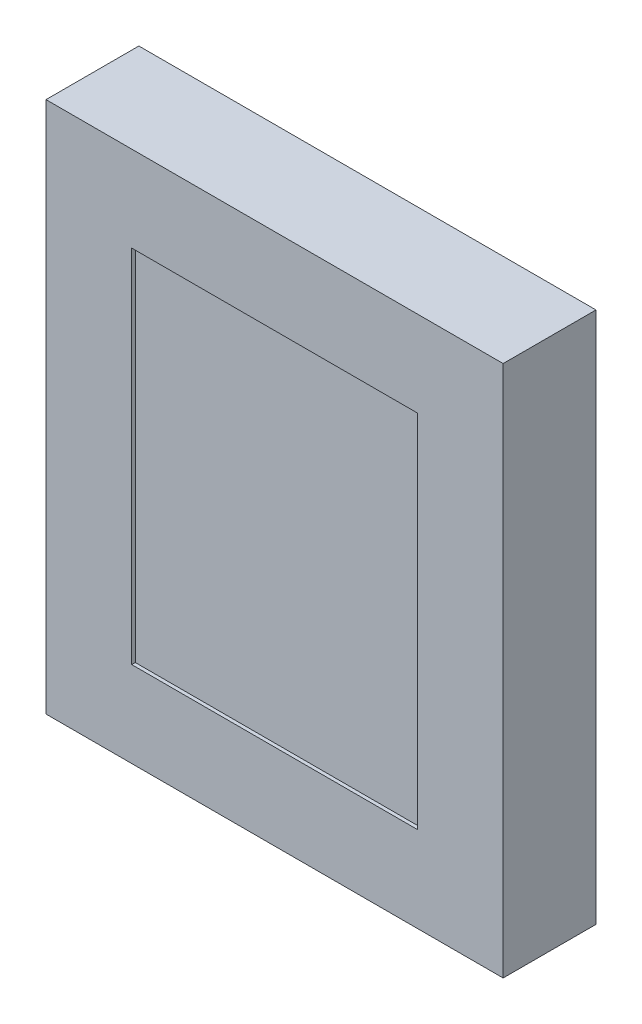
ISO-10303-21;
HEADER;
FILE_DESCRIPTION(('STEP AP214'),'2;1');
FILE_NAME('part.step','',(''),(''),'','','');
FILE_SCHEMA(('AUTOMOTIVE_DESIGN { 1 0 10303 214 1 1 1 1 }'));
ENDSEC;
DATA;
#1=APPLICATION_CONTEXT('core data for automotive mechanical design processes');
#2=APPLICATION_PROTOCOL_DEFINITION('international standard','automotive_design',2000,#1);
#3=PRODUCT_CONTEXT('',#1,'mechanical');
#4=PRODUCT('Part','Part','',(#3));
#5=PRODUCT_RELATED_PRODUCT_CATEGORY('part','',(#4));
#6=PRODUCT_DEFINITION_FORMATION('','',#4);
#7=PRODUCT_DEFINITION_CONTEXT('part definition',#1,'design');
#8=PRODUCT_DEFINITION('design','',#6,#7);
#9=PRODUCT_DEFINITION_SHAPE('','',#8);
#10=(LENGTH_UNIT() NAMED_UNIT(*) SI_UNIT(.MILLI.,.METRE.));
#11=(NAMED_UNIT(*) PLANE_ANGLE_UNIT() SI_UNIT($,.RADIAN.));
#12=(NAMED_UNIT(*) SI_UNIT($,.STERADIAN.) SOLID_ANGLE_UNIT());
#13=UNCERTAINTY_MEASURE_WITH_UNIT(LENGTH_MEASURE(1.E-05),#10,'distance_accuracy_value','');
#14=(GEOMETRIC_REPRESENTATION_CONTEXT(3) GLOBAL_UNCERTAINTY_ASSIGNED_CONTEXT((#13)) GLOBAL_UNIT_ASSIGNED_CONTEXT((#10,
#11,#12)) REPRESENTATION_CONTEXT('',''));
#15=CARTESIAN_POINT('',(0.,0.,0.));
#16=DIRECTION('',(0.,0.,1.));
#17=DIRECTION('',(1.,0.,0.));
#18=AXIS2_PLACEMENT_3D('',#15,#16,#17);
#19=CARTESIAN_POINT('',(320.,372.5,-65.));
#20=DIRECTION('',(0.,1.,0.));
#21=DIRECTION('',(0.,0.,1.));
#22=AXIS2_PLACEMENT_3D('',#19,#20,#21);
#23=PLANE('',#22);
#24=DIRECTION('',(0.,0.,1.));
#25=VECTOR('',#24,1.);
#26=CARTESIAN_POINT('',(-320.,372.5,-65.));
#27=LINE('',#26,#25);
#28=CARTESIAN_POINT('',(-320.,372.5,-65.));
#29=VERTEX_POINT('',#28);
#30=CARTESIAN_POINT('',(-320.,372.5,65.));
#31=VERTEX_POINT('',#30);
#32=EDGE_CURVE('E62',#29,#31,#27,.T.);
#33=ORIENTED_EDGE('',*,*,#32,.T.);
#34=DIRECTION('',(-1.,0.,0.));
#35=VECTOR('',#34,1.);
#36=CARTESIAN_POINT('',(320.,372.5,65.));
#37=LINE('',#36,#35);
#38=CARTESIAN_POINT('',(320.,372.5,65.));
#39=VERTEX_POINT('',#38);
#40=EDGE_CURVE('E160',#39,#31,#37,.T.);
#41=ORIENTED_EDGE('',*,*,#40,.F.);
#42=DIRECTION('',(0.,0.,1.));
#43=VECTOR('',#42,1.);
#44=CARTESIAN_POINT('',(320.,372.5,-65.));
#45=LINE('',#44,#43);
#46=CARTESIAN_POINT('',(320.,372.5,-65.));
#47=VERTEX_POINT('',#46);
#48=EDGE_CURVE('E12',#47,#39,#45,.T.);
#49=ORIENTED_EDGE('',*,*,#48,.F.);
#50=DIRECTION('',(-1.,0.,0.));
#51=VECTOR('',#50,1.);
#52=CARTESIAN_POINT('',(320.,372.5,-65.));
#53=LINE('',#52,#51);
#54=EDGE_CURVE('E188',#47,#29,#53,.T.);
#55=ORIENTED_EDGE('',*,*,#54,.T.);
#56=EDGE_LOOP('',(#33,#41,#49,#55));
#57=FACE_BOUND('',#56,.T.);
#58=ADVANCED_FACE('F59',(#57),#23,.T.);
#59=CARTESIAN_POINT('',(320.,-372.5,-65.));
#60=DIRECTION('',(1.,0.,0.));
#61=DIRECTION('',(0.,1.,0.));
#62=AXIS2_PLACEMENT_3D('',#59,#60,#61);
#63=PLANE('',#62);
#64=ORIENTED_EDGE('',*,*,#48,.T.);
#65=DIRECTION('',(0.,1.,0.));
#66=VECTOR('',#65,1.);
#67=CARTESIAN_POINT('',(320.,-372.5,65.));
#68=LINE('',#67,#66);
#69=CARTESIAN_POINT('',(320.,-372.5,65.));
#70=VERTEX_POINT('',#69);
#71=EDGE_CURVE('E172',#70,#39,#68,.T.);
#72=ORIENTED_EDGE('',*,*,#71,.F.);
#73=DIRECTION('',(0.,0.,1.));
#74=VECTOR('',#73,1.);
#75=CARTESIAN_POINT('',(320.,-372.5,-65.));
#76=LINE('',#75,#74);
#77=CARTESIAN_POINT('',(320.,-372.5,-65.));
#78=VERTEX_POINT('',#77);
#79=EDGE_CURVE('E68',#78,#70,#76,.T.);
#80=ORIENTED_EDGE('',*,*,#79,.F.);
#81=DIRECTION('',(0.,1.,0.));
#82=VECTOR('',#81,1.);
#83=CARTESIAN_POINT('',(320.,-372.5,-65.));
#84=LINE('',#83,#82);
#85=EDGE_CURVE('E204',#78,#47,#84,.T.);
#86=ORIENTED_EDGE('',*,*,#85,.T.);
#87=EDGE_LOOP('',(#64,#72,#80,#86));
#88=FACE_BOUND('',#87,.T.);
#89=ADVANCED_FACE('F220',(#88),#63,.T.);
#90=CARTESIAN_POINT('',(-320.,-372.5,-65.));
#91=DIRECTION('',(0.,-1.,0.));
#92=DIRECTION('',(0.,0.,-1.));
#93=AXIS2_PLACEMENT_3D('',#90,#91,#92);
#94=PLANE('',#93);
#95=ORIENTED_EDGE('',*,*,#79,.T.);
#96=DIRECTION('',(1.,0.,0.));
#97=VECTOR('',#96,1.);
#98=CARTESIAN_POINT('',(-320.,-372.5,65.));
#99=LINE('',#98,#97);
#100=CARTESIAN_POINT('',(-320.,-372.5,65.));
#101=VERTEX_POINT('',#100);
#102=EDGE_CURVE('E168',#101,#70,#99,.T.);
#103=ORIENTED_EDGE('',*,*,#102,.F.);
#104=DIRECTION('',(0.,0.,1.));
#105=VECTOR('',#104,1.);
#106=CARTESIAN_POINT('',(-320.,-372.5,-65.));
#107=LINE('',#106,#105);
#108=CARTESIAN_POINT('',(-320.,-372.5,-65.));
#109=VERTEX_POINT('',#108);
#110=EDGE_CURVE('E209',#109,#101,#107,.T.);
#111=ORIENTED_EDGE('',*,*,#110,.F.);
#112=DIRECTION('',(1.,0.,0.));
#113=VECTOR('',#112,1.);
#114=CARTESIAN_POINT('',(-320.,-372.5,-65.));
#115=LINE('',#114,#113);
#116=EDGE_CURVE('E200',#109,#78,#115,.T.);
#117=ORIENTED_EDGE('',*,*,#116,.T.);
#118=EDGE_LOOP('',(#95,#103,#111,#117));
#119=FACE_BOUND('',#118,.T.);
#120=ADVANCED_FACE('F226',(#119),#94,.T.);
#121=CARTESIAN_POINT('',(-320.,372.5,-65.));
#122=DIRECTION('',(-1.,0.,0.));
#123=DIRECTION('',(0.,-1.,0.));
#124=AXIS2_PLACEMENT_3D('',#121,#122,#123);
#125=PLANE('',#124);
#126=ORIENTED_EDGE('',*,*,#110,.T.);
#127=DIRECTION('',(0.,-1.,0.));
#128=VECTOR('',#127,1.);
#129=CARTESIAN_POINT('',(-320.,372.5,65.));
#130=LINE('',#129,#128);
#131=EDGE_CURVE('E164',#31,#101,#130,.T.);
#132=ORIENTED_EDGE('',*,*,#131,.F.);
#133=ORIENTED_EDGE('',*,*,#32,.F.);
#134=DIRECTION('',(0.,-1.,0.));
#135=VECTOR('',#134,1.);
#136=CARTESIAN_POINT('',(-320.,372.5,-65.));
#137=LINE('',#136,#135);
#138=EDGE_CURVE('E196',#29,#109,#137,.T.);
#139=ORIENTED_EDGE('',*,*,#138,.T.);
#140=EDGE_LOOP('',(#126,#132,#133,#139));
#141=FACE_BOUND('',#140,.T.);
#142=ADVANCED_FACE('F215',(#141),#125,.T.);
#143=CARTESIAN_POINT('',(0.,0.,-65.));
#144=DIRECTION('',(0.,0.,1.));
#145=DIRECTION('',(1.,0.,0.));
#146=AXIS2_PLACEMENT_3D('',#143,#144,#145);
#147=PLANE('',#146);
#148=DIRECTION('',(0.,1.,0.));
#149=VECTOR('',#148,1.);
#150=CARTESIAN_POINT('',(200.,-252.5,-65.));
#151=LINE('',#150,#149);
#152=CARTESIAN_POINT('',(200.,-252.5,-65.));
#153=VERTEX_POINT('',#152);
#154=CARTESIAN_POINT('',(200.,252.5,-65.));
#155=VERTEX_POINT('',#154);
#156=EDGE_CURVE('E138',#153,#155,#151,.T.);
#157=ORIENTED_EDGE('',*,*,#156,.T.);
#158=DIRECTION('',(-1.,0.,0.));
#159=VECTOR('',#158,1.);
#160=CARTESIAN_POINT('',(200.,252.5,-65.));
#161=LINE('',#160,#159);
#162=CARTESIAN_POINT('',(-200.,252.5,-65.));
#163=VERTEX_POINT('',#162);
#164=EDGE_CURVE('E176',#155,#163,#161,.T.);
#165=ORIENTED_EDGE('',*,*,#164,.T.);
#166=DIRECTION('',(0.,-1.,0.));
#167=VECTOR('',#166,1.);
#168=CARTESIAN_POINT('',(-200.,252.5,-65.));
#169=LINE('',#168,#167);
#170=CARTESIAN_POINT('',(-200.,-252.5,-65.));
#171=VERTEX_POINT('',#170);
#172=EDGE_CURVE('E132',#163,#171,#169,.T.);
#173=ORIENTED_EDGE('',*,*,#172,.T.);
#174=DIRECTION('',(1.,0.,0.));
#175=VECTOR('',#174,1.);
#176=CARTESIAN_POINT('',(-200.,-252.5,-65.));
#177=LINE('',#176,#175);
#178=EDGE_CURVE('E76',#171,#153,#177,.T.);
#179=ORIENTED_EDGE('',*,*,#178,.T.);
#180=EDGE_LOOP('',(#157,#165,#173,#179));
#181=FACE_BOUND('',#180,.T.);
#182=ORIENTED_EDGE('',*,*,#54,.F.);
#183=ORIENTED_EDGE('',*,*,#85,.F.);
#184=ORIENTED_EDGE('',*,*,#116,.F.);
#185=ORIENTED_EDGE('',*,*,#138,.F.);
#186=EDGE_LOOP('',(#182,#183,#184,#185));
#187=FACE_BOUND('',#186,.T.);
#188=ADVANCED_FACE('F224',(#181,#187),#147,.F.);
#189=CARTESIAN_POINT('',(200.,252.5,-65.));
#190=DIRECTION('',(0.,1.,0.));
#191=DIRECTION('',(0.,0.,1.));
#192=AXIS2_PLACEMENT_3D('',#189,#190,#191);
#193=PLANE('',#192);
#194=DIRECTION('',(0.,0.,1.));
#195=VECTOR('',#194,1.);
#196=CARTESIAN_POINT('',(200.,252.5,-65.));
#197=LINE('',#196,#195);
#198=CARTESIAN_POINT('',(200.,252.5,65.));
#199=VERTEX_POINT('',#198);
#200=EDGE_CURVE('E143',#155,#199,#197,.T.);
#201=ORIENTED_EDGE('',*,*,#200,.T.);
#202=DIRECTION('',(-1.,0.,0.));
#203=VECTOR('',#202,1.);
#204=CARTESIAN_POINT('',(200.,252.5,65.));
#205=LINE('',#204,#203);
#206=CARTESIAN_POINT('',(-200.,252.5,65.));
#207=VERTEX_POINT('',#206);
#208=EDGE_CURVE('E141',#199,#207,#205,.T.);
#209=ORIENTED_EDGE('',*,*,#208,.T.);
#210=DIRECTION('',(0.,0.,1.));
#211=VECTOR('',#210,1.);
#212=CARTESIAN_POINT('',(-200.,252.5,-65.));
#213=LINE('',#212,#211);
#214=EDGE_CURVE('E125',#163,#207,#213,.T.);
#215=ORIENTED_EDGE('',*,*,#214,.F.);
#216=ORIENTED_EDGE('',*,*,#164,.F.);
#217=EDGE_LOOP('',(#201,#209,#215,#216));
#218=FACE_BOUND('',#217,.T.);
#219=ADVANCED_FACE('F142',(#218),#193,.F.);
#220=CARTESIAN_POINT('',(200.,-252.5,-65.));
#221=DIRECTION('',(1.,0.,0.));
#222=DIRECTION('',(0.,1.,0.));
#223=AXIS2_PLACEMENT_3D('',#220,#221,#222);
#224=PLANE('',#223);
#225=DIRECTION('',(0.,0.,1.));
#226=VECTOR('',#225,1.);
#227=CARTESIAN_POINT('',(200.,-252.5,-65.));
#228=LINE('',#227,#226);
#229=CARTESIAN_POINT('',(200.,-252.5,65.));
#230=VERTEX_POINT('',#229);
#231=EDGE_CURVE('E189',#153,#230,#228,.T.);
#232=ORIENTED_EDGE('',*,*,#231,.T.);
#233=DIRECTION('',(0.,1.,0.));
#234=VECTOR('',#233,1.);
#235=CARTESIAN_POINT('',(200.,-252.5,65.));
#236=LINE('',#235,#234);
#237=EDGE_CURVE('E155',#230,#199,#236,.T.);
#238=ORIENTED_EDGE('',*,*,#237,.T.);
#239=ORIENTED_EDGE('',*,*,#200,.F.);
#240=ORIENTED_EDGE('',*,*,#156,.F.);
#241=EDGE_LOOP('',(#232,#238,#239,#240));
#242=FACE_BOUND('',#241,.T.);
#243=ADVANCED_FACE('F269',(#242),#224,.F.);
#244=CARTESIAN_POINT('',(-200.,-252.5,-65.));
#245=DIRECTION('',(0.,-1.,0.));
#246=DIRECTION('',(0.,0.,-1.));
#247=AXIS2_PLACEMENT_3D('',#244,#245,#246);
#248=PLANE('',#247);
#249=DIRECTION('',(0.,0.,1.));
#250=VECTOR('',#249,1.);
#251=CARTESIAN_POINT('',(-200.,-252.5,-65.));
#252=LINE('',#251,#250);
#253=CARTESIAN_POINT('',(-200.,-252.5,65.));
#254=VERTEX_POINT('',#253);
#255=EDGE_CURVE('E137',#171,#254,#252,.T.);
#256=ORIENTED_EDGE('',*,*,#255,.T.);
#257=DIRECTION('',(1.,0.,0.));
#258=VECTOR('',#257,1.);
#259=CARTESIAN_POINT('',(-200.,-252.5,65.));
#260=LINE('',#259,#258);
#261=EDGE_CURVE('E151',#254,#230,#260,.T.);
#262=ORIENTED_EDGE('',*,*,#261,.T.);
#263=ORIENTED_EDGE('',*,*,#231,.F.);
#264=ORIENTED_EDGE('',*,*,#178,.F.);
#265=EDGE_LOOP('',(#256,#262,#263,#264));
#266=FACE_BOUND('',#265,.T.);
#267=ADVANCED_FACE('F278',(#266),#248,.F.);
#268=CARTESIAN_POINT('',(-200.,252.5,-65.));
#269=DIRECTION('',(-1.,0.,0.));
#270=DIRECTION('',(0.,-1.,0.));
#271=AXIS2_PLACEMENT_3D('',#268,#269,#270);
#272=PLANE('',#271);
#273=ORIENTED_EDGE('',*,*,#214,.T.);
#274=DIRECTION('',(0.,-1.,0.));
#275=VECTOR('',#274,1.);
#276=CARTESIAN_POINT('',(-200.,252.5,65.));
#277=LINE('',#276,#275);
#278=EDGE_CURVE('E129',#207,#254,#277,.T.);
#279=ORIENTED_EDGE('',*,*,#278,.T.);
#280=ORIENTED_EDGE('',*,*,#255,.F.);
#281=ORIENTED_EDGE('',*,*,#172,.F.);
#282=EDGE_LOOP('',(#273,#279,#280,#281));
#283=FACE_BOUND('',#282,.T.);
#284=ADVANCED_FACE('F127',(#283),#272,.F.);
#285=CARTESIAN_POINT('',(0.,0.,65.));
#286=DIRECTION('',(0.,0.,1.));
#287=DIRECTION('',(1.,0.,0.));
#288=AXIS2_PLACEMENT_3D('',#285,#286,#287);
#289=PLANE('',#288);
#290=ORIENTED_EDGE('',*,*,#40,.T.);
#291=ORIENTED_EDGE('',*,*,#131,.T.);
#292=ORIENTED_EDGE('',*,*,#102,.T.);
#293=ORIENTED_EDGE('',*,*,#71,.T.);
#294=EDGE_LOOP('',(#290,#291,#292,#293));
#295=FACE_BOUND('',#294,.T.);
#296=ORIENTED_EDGE('',*,*,#278,.F.);
#297=ORIENTED_EDGE('',*,*,#208,.F.);
#298=ORIENTED_EDGE('',*,*,#237,.F.);
#299=ORIENTED_EDGE('',*,*,#261,.F.);
#300=EDGE_LOOP('',(#296,#297,#298,#299));
#301=FACE_BOUND('',#300,.T.);
#302=ADVANCED_FACE('F149',(#295,#301),#289,.T.);
#303=CLOSED_SHELL('',(#58,#89,#120,#142,#188,#219,#243,#267,#284,#302));
#304=MANIFOLD_SOLID_BREP('B2',#303);
#305=CARTESIAN_POINT('',(-200.,252.5,-60.));
#306=DIRECTION('',(-1.,0.,0.));
#307=DIRECTION('',(0.,-1.,0.));
#308=AXIS2_PLACEMENT_3D('',#305,#306,#307);
#309=PLANE('',#308);
#310=DIRECTION('',(0.,0.,1.));
#311=VECTOR('',#310,1.);
#312=CARTESIAN_POINT('',(-200.,-252.5,-60.));
#313=LINE('',#312,#311);
#314=CARTESIAN_POINT('',(-200.,-252.5,-60.));
#315=VERTEX_POINT('',#314);
#316=CARTESIAN_POINT('',(-200.,-252.5,60.));
#317=VERTEX_POINT('',#316);
#318=EDGE_CURVE('E356',#315,#317,#313,.T.);
#319=ORIENTED_EDGE('',*,*,#318,.T.);
#320=DIRECTION('',(0.,-1.,0.));
#321=VECTOR('',#320,1.);
#322=CARTESIAN_POINT('',(-200.,252.5,60.));
#323=LINE('',#322,#321);
#324=CARTESIAN_POINT('',(-200.,252.5,60.));
#325=VERTEX_POINT('',#324);
#326=EDGE_CURVE('E393',#325,#317,#323,.T.);
#327=ORIENTED_EDGE('',*,*,#326,.F.);
#328=DIRECTION('',(0.,0.,1.));
#329=VECTOR('',#328,1.);
#330=CARTESIAN_POINT('',(-200.,252.5,-60.));
#331=LINE('',#330,#329);
#332=CARTESIAN_POINT('',(-200.,252.5,-60.));
#333=VERTEX_POINT('',#332);
#334=EDGE_CURVE('E57',#333,#325,#331,.T.);
#335=ORIENTED_EDGE('',*,*,#334,.F.);
#336=DIRECTION('',(0.,-1.,0.));
#337=VECTOR('',#336,1.);
#338=CARTESIAN_POINT('',(-200.,252.5,-60.));
#339=LINE('',#338,#337);
#340=EDGE_CURVE('E394',#333,#315,#339,.T.);
#341=ORIENTED_EDGE('',*,*,#340,.T.);
#342=EDGE_LOOP('',(#319,#327,#335,#341));
#343=FACE_BOUND('',#342,.T.);
#344=ADVANCED_FACE('F353',(#343),#309,.T.);
#345=CARTESIAN_POINT('',(200.,252.5,-60.));
#346=DIRECTION('',(0.,1.,0.));
#347=DIRECTION('',(0.,0.,1.));
#348=AXIS2_PLACEMENT_3D('',#345,#346,#347);
#349=PLANE('',#348);
#350=ORIENTED_EDGE('',*,*,#334,.T.);
#351=DIRECTION('',(-1.,0.,0.));
#352=VECTOR('',#351,1.);
#353=CARTESIAN_POINT('',(200.,252.5,60.));
#354=LINE('',#353,#352);
#355=CARTESIAN_POINT('',(200.,252.5,60.));
#356=VERTEX_POINT('',#355);
#357=EDGE_CURVE('E410',#356,#325,#354,.T.);
#358=ORIENTED_EDGE('',*,*,#357,.F.);
#359=DIRECTION('',(0.,0.,1.));
#360=VECTOR('',#359,1.);
#361=CARTESIAN_POINT('',(200.,252.5,-60.));
#362=LINE('',#361,#360);
#363=CARTESIAN_POINT('',(200.,252.5,-60.));
#364=VERTEX_POINT('',#363);
#365=EDGE_CURVE('E361',#364,#356,#362,.T.);
#366=ORIENTED_EDGE('',*,*,#365,.F.);
#367=DIRECTION('',(-1.,0.,0.));
#368=VECTOR('',#367,1.);
#369=CARTESIAN_POINT('',(200.,252.5,-60.));
#370=LINE('',#369,#368);
#371=EDGE_CURVE('E399',#364,#333,#370,.T.);
#372=ORIENTED_EDGE('',*,*,#371,.T.);
#373=EDGE_LOOP('',(#350,#358,#366,#372));
#374=FACE_BOUND('',#373,.T.);
#375=ADVANCED_FACE('F425',(#374),#349,.T.);
#376=CARTESIAN_POINT('',(200.,252.5,-60.));
#377=DIRECTION('',(1.,0.,0.));
#378=DIRECTION('',(0.,1.,0.));
#379=AXIS2_PLACEMENT_3D('',#376,#377,#378);
#380=PLANE('',#379);
#381=ORIENTED_EDGE('',*,*,#365,.T.);
#382=DIRECTION('',(0.,1.,0.));
#383=VECTOR('',#382,1.);
#384=CARTESIAN_POINT('',(200.,252.5,60.));
#385=LINE('',#384,#383);
#386=CARTESIAN_POINT('',(200.,-252.5,60.));
#387=VERTEX_POINT('',#386);
#388=EDGE_CURVE('E406',#387,#356,#385,.T.);
#389=ORIENTED_EDGE('',*,*,#388,.F.);
#390=DIRECTION('',(0.,0.,1.));
#391=VECTOR('',#390,1.);
#392=CARTESIAN_POINT('',(200.,-252.5,-60.));
#393=LINE('',#392,#391);
#394=CARTESIAN_POINT('',(200.,-252.5,-60.));
#395=VERTEX_POINT('',#394);
#396=EDGE_CURVE('E398',#395,#387,#393,.T.);
#397=ORIENTED_EDGE('',*,*,#396,.F.);
#398=DIRECTION('',(0.,1.,0.));
#399=VECTOR('',#398,1.);
#400=CARTESIAN_POINT('',(200.,252.5,-60.));
#401=LINE('',#400,#399);
#402=EDGE_CURVE('E418',#395,#364,#401,.T.);
#403=ORIENTED_EDGE('',*,*,#402,.T.);
#404=EDGE_LOOP('',(#381,#389,#397,#403));
#405=FACE_BOUND('',#404,.T.);
#406=ADVANCED_FACE('F422',(#405),#380,.T.);
#407=CARTESIAN_POINT('',(200.,-252.5,-60.));
#408=DIRECTION('',(0.,-1.,0.));
#409=DIRECTION('',(0.,0.,-1.));
#410=AXIS2_PLACEMENT_3D('',#407,#408,#409);
#411=PLANE('',#410);
#412=ORIENTED_EDGE('',*,*,#396,.T.);
#413=DIRECTION('',(1.,0.,0.));
#414=VECTOR('',#413,1.);
#415=CARTESIAN_POINT('',(200.,-252.5,60.));
#416=LINE('',#415,#414);
#417=EDGE_CURVE('E401',#317,#387,#416,.T.);
#418=ORIENTED_EDGE('',*,*,#417,.F.);
#419=ORIENTED_EDGE('',*,*,#318,.F.);
#420=DIRECTION('',(1.,0.,0.));
#421=VECTOR('',#420,1.);
#422=CARTESIAN_POINT('',(200.,-252.5,-60.));
#423=LINE('',#422,#421);
#424=EDGE_CURVE('E416',#315,#395,#423,.T.);
#425=ORIENTED_EDGE('',*,*,#424,.T.);
#426=EDGE_LOOP('',(#412,#418,#419,#425));
#427=FACE_BOUND('',#426,.T.);
#428=ADVANCED_FACE('F402',(#427),#411,.T.);
#429=CARTESIAN_POINT('',(0.,0.,-60.));
#430=DIRECTION('',(0.,0.,-1.));
#431=DIRECTION('',(-1.,0.,0.));
#432=AXIS2_PLACEMENT_3D('',#429,#430,#431);
#433=PLANE('',#432);
#434=ORIENTED_EDGE('',*,*,#340,.F.);
#435=ORIENTED_EDGE('',*,*,#371,.F.);
#436=ORIENTED_EDGE('',*,*,#402,.F.);
#437=ORIENTED_EDGE('',*,*,#424,.F.);
#438=EDGE_LOOP('',(#434,#435,#436,#437));
#439=FACE_BOUND('',#438,.T.);
#440=ADVANCED_FACE('F427',(#439),#433,.T.);
#441=CARTESIAN_POINT('',(0.,0.,60.));
#442=DIRECTION('',(0.,0.,-1.));
#443=DIRECTION('',(-1.,0.,0.));
#444=AXIS2_PLACEMENT_3D('',#441,#442,#443);
#445=PLANE('',#444);
#446=ORIENTED_EDGE('',*,*,#326,.T.);
#447=ORIENTED_EDGE('',*,*,#417,.T.);
#448=ORIENTED_EDGE('',*,*,#388,.T.);
#449=ORIENTED_EDGE('',*,*,#357,.T.);
#450=EDGE_LOOP('',(#446,#447,#448,#449));
#451=FACE_BOUND('',#450,.T.);
#452=ADVANCED_FACE('F409',(#451),#445,.F.);
#453=CLOSED_SHELL('',(#344,#375,#406,#428,#440,#452));
#454=MANIFOLD_SOLID_BREP('B6',#453);
#455=ADVANCED_BREP_SHAPE_REPRESENTATION('',(#18,#304,#454),#14);
#456=SHAPE_DEFINITION_REPRESENTATION(#9,#455);
ENDSEC;
END-ISO-10303-21;
